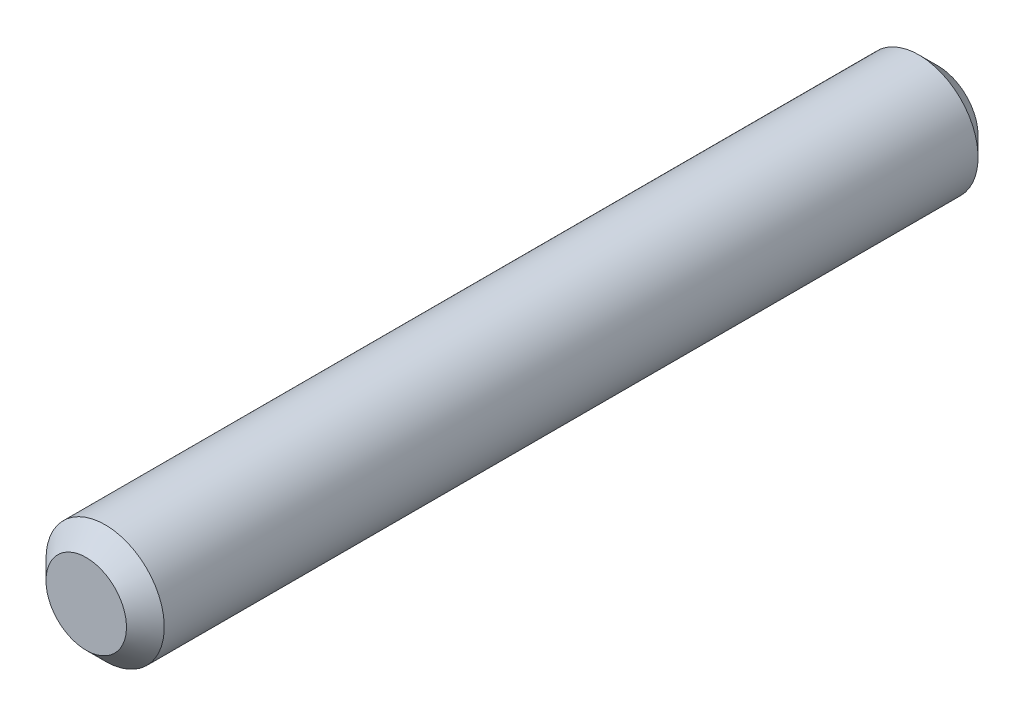
ISO-10303-21;
HEADER;
FILE_DESCRIPTION(('STEP AP214'),'2;1');
FILE_NAME('part.step','',(''),(''),'','','');
FILE_SCHEMA(('AUTOMOTIVE_DESIGN { 1 0 10303 214 1 1 1 1 }'));
ENDSEC;
DATA;
#1=APPLICATION_CONTEXT('core data for automotive mechanical design processes');
#2=APPLICATION_PROTOCOL_DEFINITION('international standard','automotive_design',2000,#1);
#3=PRODUCT_CONTEXT('',#1,'mechanical');
#4=PRODUCT('Part','Part','',(#3));
#5=PRODUCT_RELATED_PRODUCT_CATEGORY('part','',(#4));
#6=PRODUCT_DEFINITION_FORMATION('','',#4);
#7=PRODUCT_DEFINITION_CONTEXT('part definition',#1,'design');
#8=PRODUCT_DEFINITION('design','',#6,#7);
#9=PRODUCT_DEFINITION_SHAPE('','',#8);
#10=(LENGTH_UNIT() NAMED_UNIT(*) SI_UNIT(.MILLI.,.METRE.));
#11=(NAMED_UNIT(*) PLANE_ANGLE_UNIT() SI_UNIT($,.RADIAN.));
#12=(NAMED_UNIT(*) SI_UNIT($,.STERADIAN.) SOLID_ANGLE_UNIT());
#13=UNCERTAINTY_MEASURE_WITH_UNIT(LENGTH_MEASURE(1.E-05),#10,'distance_accuracy_value','');
#14=(GEOMETRIC_REPRESENTATION_CONTEXT(3) GLOBAL_UNCERTAINTY_ASSIGNED_CONTEXT((#13)) GLOBAL_UNIT_ASSIGNED_CONTEXT((#10,
#11,#12)) REPRESENTATION_CONTEXT('',''));
#15=CARTESIAN_POINT('',(0.,0.,0.));
#16=DIRECTION('',(0.,0.,1.));
#17=DIRECTION('',(1.,0.,0.));
#18=AXIS2_PLACEMENT_3D('',#15,#16,#17);
#19=CARTESIAN_POINT('',(0.,0.,5.715));
#20=DIRECTION('',(0.,0.,-1.));
#21=DIRECTION('',(1.,0.,0.));
#22=AXIS2_PLACEMENT_3D('',#19,#20,#21);
#23=CYLINDRICAL_SURFACE('',#22,0.79375);
#24=CARTESIAN_POINT('',(0.,0.,-5.461));
#25=DIRECTION('',(0.,0.,-1.));
#26=DIRECTION('',(-1.,0.,0.));
#27=AXIS2_PLACEMENT_3D('',#24,#25,#26);
#28=CIRCLE('',#27,0.79375);
#29=CARTESIAN_POINT('',(-0.79375,0.,-5.461));
#30=VERTEX_POINT('',#29);
#31=EDGE_CURVE('E380',#30,#30,#28,.T.);
#32=ORIENTED_EDGE('',*,*,#31,.F.);
#33=EDGE_LOOP('',(#32));
#34=FACE_BOUND('',#33,.T.);
#35=CARTESIAN_POINT('',(0.,0.,5.461));
#36=DIRECTION('',(0.,0.,-1.));
#37=DIRECTION('',(-1.,0.,0.));
#38=AXIS2_PLACEMENT_3D('',#35,#36,#37);
#39=CIRCLE('',#38,0.79375);
#40=CARTESIAN_POINT('',(-0.79375,0.,5.461));
#41=VERTEX_POINT('',#40);
#42=EDGE_CURVE('E384',#41,#41,#39,.F.);
#43=ORIENTED_EDGE('',*,*,#42,.F.);
#44=EDGE_LOOP('',(#43));
#45=FACE_BOUND('',#44,.T.);
#46=ADVANCED_FACE('F370',(#34,#45),#23,.T.);
#47=CARTESIAN_POINT('',(0.,0.,5.715));
#48=DIRECTION('',(0.,0.,1.));
#49=DIRECTION('',(-1.,0.,0.));
#50=AXIS2_PLACEMENT_3D('',#47,#48,#49);
#51=PLANE('',#50);
#52=CARTESIAN_POINT('',(0.,0.,5.715));
#53=DIRECTION('',(0.,0.,-1.));
#54=DIRECTION('',(-1.,0.,0.));
#55=AXIS2_PLACEMENT_3D('',#52,#53,#54);
#56=CIRCLE('',#55,0.53975);
#57=CARTESIAN_POINT('',(-0.53975,0.,5.715));
#58=VERTEX_POINT('',#57);
#59=EDGE_CURVE('E10',#58,#58,#56,.T.);
#60=ORIENTED_EDGE('',*,*,#59,.F.);
#61=EDGE_LOOP('',(#60));
#62=FACE_BOUND('',#61,.T.);
#63=ADVANCED_FACE('F393',(#62),#51,.T.);
#64=CARTESIAN_POINT('',(0.,0.,-5.715));
#65=DIRECTION('',(0.,0.,1.));
#66=DIRECTION('',(-1.,0.,0.));
#67=AXIS2_PLACEMENT_3D('',#64,#65,#66);
#68=PLANE('',#67);
#69=CARTESIAN_POINT('',(0.,0.,-5.715));
#70=DIRECTION('',(0.,0.,-1.));
#71=DIRECTION('',(-1.,0.,0.));
#72=AXIS2_PLACEMENT_3D('',#69,#70,#71);
#73=CIRCLE('',#72,0.53975);
#74=CARTESIAN_POINT('',(-0.53975,0.,-5.715));
#75=VERTEX_POINT('',#74);
#76=EDGE_CURVE('E376',#75,#75,#73,.F.);
#77=ORIENTED_EDGE('',*,*,#76,.F.);
#78=EDGE_LOOP('',(#77));
#79=FACE_BOUND('',#78,.T.);
#80=ADVANCED_FACE('F398',(#79),#68,.F.);
#81=CARTESIAN_POINT('',(0.,0.,-5.461));
#82=DIRECTION('',(0.,0.,1.));
#83=DIRECTION('',(-1.,0.,0.));
#84=AXIS2_PLACEMENT_3D('',#81,#82,#83);
#85=CONICAL_SURFACE('',#84,0.79375,0.785398163397451);
#86=ORIENTED_EDGE('',*,*,#76,.T.);
#87=EDGE_LOOP('',(#86));
#88=FACE_BOUND('',#87,.T.);
#89=ORIENTED_EDGE('',*,*,#31,.T.);
#90=EDGE_LOOP('',(#89));
#91=FACE_BOUND('',#90,.T.);
#92=ADVANCED_FACE('F402',(#88,#91),#85,.T.);
#93=CARTESIAN_POINT('',(0.,0.,5.715));
#94=DIRECTION('',(0.,0.,-1.));
#95=DIRECTION('',(1.,0.,0.));
#96=AXIS2_PLACEMENT_3D('',#93,#94,#95);
#97=CONICAL_SURFACE('',#96,0.53975,0.785398163397447);
#98=ORIENTED_EDGE('',*,*,#42,.T.);
#99=EDGE_LOOP('',(#98));
#100=FACE_BOUND('',#99,.T.);
#101=ORIENTED_EDGE('',*,*,#59,.T.);
#102=EDGE_LOOP('',(#101));
#103=FACE_BOUND('',#102,.T.);
#104=ADVANCED_FACE('F390',(#100,#103),#97,.T.);
#105=CLOSED_SHELL('',(#46,#63,#80,#92,#104));
#106=MANIFOLD_SOLID_BREP('B2',#105);
#107=ADVANCED_BREP_SHAPE_REPRESENTATION('',(#18,#106),#14);
#108=SHAPE_DEFINITION_REPRESENTATION(#9,#107);
ENDSEC;
END-ISO-10303-21;
